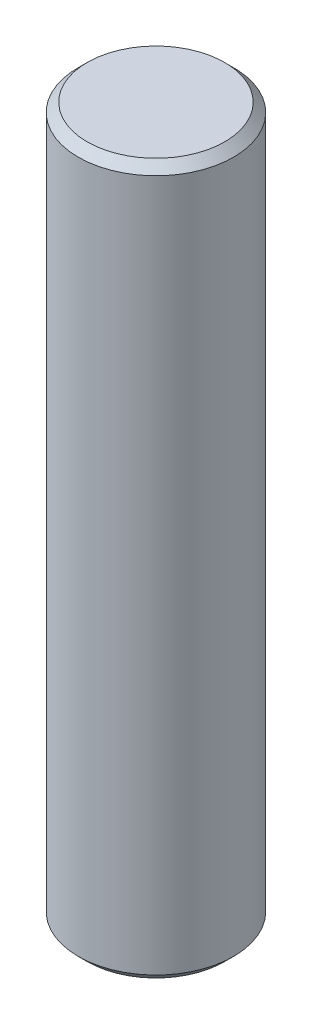
ISO-10303-21;
HEADER;
FILE_DESCRIPTION(('STEP AP214'),'2;1');
FILE_NAME('part.step','',(''),(''),'','','');
FILE_SCHEMA(('AUTOMOTIVE_DESIGN { 1 0 10303 214 1 1 1 1 }'));
ENDSEC;
DATA;
#1=APPLICATION_CONTEXT('core data for automotive mechanical design processes');
#2=APPLICATION_PROTOCOL_DEFINITION('international standard','automotive_design',2000,#1);
#3=PRODUCT_CONTEXT('',#1,'mechanical');
#4=PRODUCT('Part','Part','',(#3));
#5=PRODUCT_RELATED_PRODUCT_CATEGORY('part','',(#4));
#6=PRODUCT_DEFINITION_FORMATION('','',#4);
#7=PRODUCT_DEFINITION_CONTEXT('part definition',#1,'design');
#8=PRODUCT_DEFINITION('design','',#6,#7);
#9=PRODUCT_DEFINITION_SHAPE('','',#8);
#10=(LENGTH_UNIT() NAMED_UNIT(*) SI_UNIT(.MILLI.,.METRE.));
#11=(NAMED_UNIT(*) PLANE_ANGLE_UNIT() SI_UNIT($,.RADIAN.));
#12=(NAMED_UNIT(*) SI_UNIT($,.STERADIAN.) SOLID_ANGLE_UNIT());
#13=UNCERTAINTY_MEASURE_WITH_UNIT(LENGTH_MEASURE(1.E-05),#10,'distance_accuracy_value','');
#14=(GEOMETRIC_REPRESENTATION_CONTEXT(3) GLOBAL_UNCERTAINTY_ASSIGNED_CONTEXT((#13)) GLOBAL_UNIT_ASSIGNED_CONTEXT((#10,
#11,#12)) REPRESENTATION_CONTEXT('',''));
#15=CARTESIAN_POINT('',(0.,0.,0.));
#16=DIRECTION('',(0.,0.,1.));
#17=DIRECTION('',(1.,0.,0.));
#18=AXIS2_PLACEMENT_3D('',#15,#16,#17);
#19=CARTESIAN_POINT('',(0.,16.,0.));
#20=DIRECTION('',(0.,-1.,0.));
#21=DIRECTION('',(0.,0.,-1.));
#22=AXIS2_PLACEMENT_3D('',#19,#20,#21);
#23=CYLINDRICAL_SURFACE('',#22,1.75);
#24=CARTESIAN_POINT('',(0.,0.199999999999999,0.));
#25=DIRECTION('',(0.,1.,0.));
#26=DIRECTION('',(0.,0.,1.));
#27=AXIS2_PLACEMENT_3D('',#24,#25,#26);
#28=CIRCLE('',#27,1.75);
#29=CARTESIAN_POINT('',(0.,0.199999999999999,1.75));
#30=VERTEX_POINT('',#29);
#31=EDGE_CURVE('E47',#30,#30,#28,.T.);
#32=ORIENTED_EDGE('',*,*,#31,.T.);
#33=EDGE_LOOP('',(#32));
#34=FACE_BOUND('',#33,.T.);
#35=CARTESIAN_POINT('',(0.,15.8,0.));
#36=DIRECTION('',(0.,1.,0.));
#37=DIRECTION('',(0.,0.,1.));
#38=AXIS2_PLACEMENT_3D('',#35,#36,#37);
#39=CIRCLE('',#38,1.75);
#40=CARTESIAN_POINT('',(0.,15.8,1.75));
#41=VERTEX_POINT('',#40);
#42=EDGE_CURVE('E51',#41,#41,#39,.F.);
#43=ORIENTED_EDGE('',*,*,#42,.T.);
#44=EDGE_LOOP('',(#43));
#45=FACE_BOUND('',#44,.T.);
#46=ADVANCED_FACE('F35',(#34,#45),#23,.T.);
#47=CARTESIAN_POINT('',(0.,16.,0.));
#48=DIRECTION('',(0.,1.,0.));
#49=DIRECTION('',(0.,0.,1.));
#50=AXIS2_PLACEMENT_3D('',#47,#48,#49);
#51=PLANE('',#50);
#52=CARTESIAN_POINT('',(0.,16.,0.));
#53=DIRECTION('',(0.,1.,0.));
#54=DIRECTION('',(0.,0.,1.));
#55=AXIS2_PLACEMENT_3D('',#52,#53,#54);
#56=CIRCLE('',#55,1.55);
#57=CARTESIAN_POINT('',(0.,16.,1.55));
#58=VERTEX_POINT('',#57);
#59=EDGE_CURVE('E10',#58,#58,#56,.T.);
#60=ORIENTED_EDGE('',*,*,#59,.T.);
#61=EDGE_LOOP('',(#60));
#62=FACE_BOUND('',#61,.T.);
#63=ADVANCED_FACE('F67',(#62),#51,.T.);
#64=CARTESIAN_POINT('',(0.,0.,0.));
#65=DIRECTION('',(0.,1.,0.));
#66=DIRECTION('',(0.,0.,1.));
#67=AXIS2_PLACEMENT_3D('',#64,#65,#66);
#68=PLANE('',#67);
#69=CARTESIAN_POINT('',(0.,0.,0.));
#70=DIRECTION('',(0.,1.,0.));
#71=DIRECTION('',(0.,0.,1.));
#72=AXIS2_PLACEMENT_3D('',#69,#70,#71);
#73=CIRCLE('',#72,1.55);
#74=CARTESIAN_POINT('',(0.,0.,1.55));
#75=VERTEX_POINT('',#74);
#76=EDGE_CURVE('E43',#75,#75,#73,.F.);
#77=ORIENTED_EDGE('',*,*,#76,.T.);
#78=EDGE_LOOP('',(#77));
#79=FACE_BOUND('',#78,.T.);
#80=ADVANCED_FACE('F64',(#79),#68,.F.);
#81=CARTESIAN_POINT('',(0.,0.199999999999999,0.));
#82=DIRECTION('',(0.,1.,0.));
#83=DIRECTION('',(0.,0.,1.));
#84=AXIS2_PLACEMENT_3D('',#81,#82,#83);
#85=CONICAL_SURFACE('',#84,1.75,0.785398163397453);
#86=ORIENTED_EDGE('',*,*,#76,.F.);
#87=EDGE_LOOP('',(#86));
#88=FACE_BOUND('',#87,.T.);
#89=ORIENTED_EDGE('',*,*,#31,.F.);
#90=EDGE_LOOP('',(#89));
#91=FACE_BOUND('',#90,.T.);
#92=ADVANCED_FACE('F60',(#88,#91),#85,.T.);
#93=CARTESIAN_POINT('',(0.,16.,0.));
#94=DIRECTION('',(0.,-1.,0.));
#95=DIRECTION('',(0.,0.,-1.));
#96=AXIS2_PLACEMENT_3D('',#93,#94,#95);
#97=CONICAL_SURFACE('',#96,1.55,0.785398163397453);
#98=ORIENTED_EDGE('',*,*,#42,.F.);
#99=EDGE_LOOP('',(#98));
#100=FACE_BOUND('',#99,.T.);
#101=ORIENTED_EDGE('',*,*,#59,.F.);
#102=EDGE_LOOP('',(#101));
#103=FACE_BOUND('',#102,.T.);
#104=ADVANCED_FACE('F38',(#100,#103),#97,.T.);
#105=CLOSED_SHELL('',(#46,#63,#80,#92,#104));
#106=MANIFOLD_SOLID_BREP('B2',#105);
#107=ADVANCED_BREP_SHAPE_REPRESENTATION('',(#18,#106),#14);
#108=SHAPE_DEFINITION_REPRESENTATION(#9,#107);
ENDSEC;
END-ISO-10303-21;
